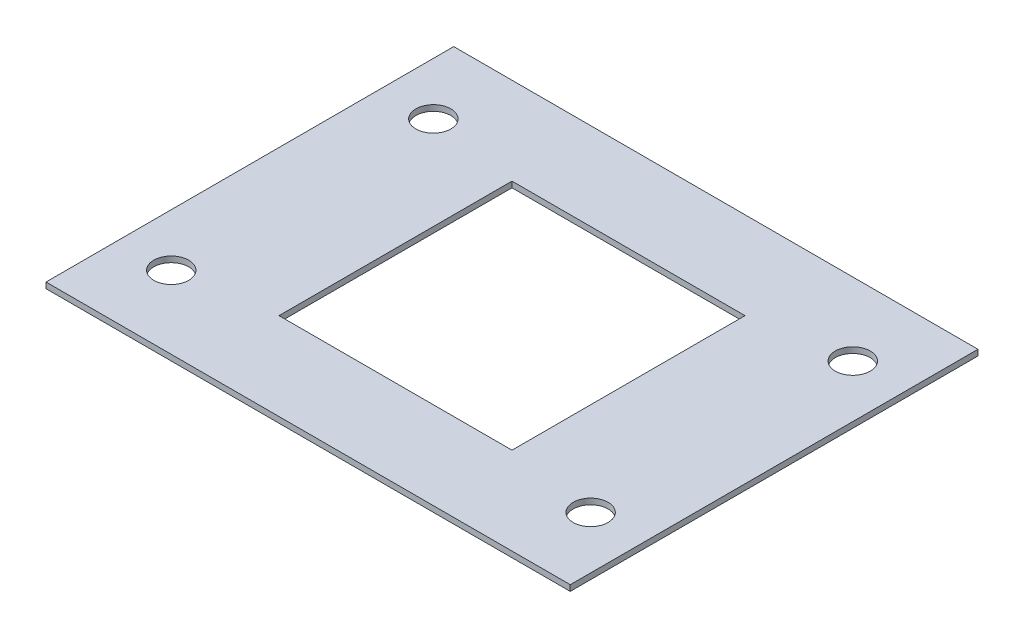
ISO-10303-21;
HEADER;
FILE_DESCRIPTION(('STEP AP214'),'2;1');
FILE_NAME('part.step','',(''),(''),'','','');
FILE_SCHEMA(('AUTOMOTIVE_DESIGN { 1 0 10303 214 1 1 1 1 }'));
ENDSEC;
DATA;
#1=APPLICATION_CONTEXT('core data for automotive mechanical design processes');
#2=APPLICATION_PROTOCOL_DEFINITION('international standard','automotive_design',2000,#1);
#3=PRODUCT_CONTEXT('',#1,'mechanical');
#4=PRODUCT('Part','Part','',(#3));
#5=PRODUCT_RELATED_PRODUCT_CATEGORY('part','',(#4));
#6=PRODUCT_DEFINITION_FORMATION('','',#4);
#7=PRODUCT_DEFINITION_CONTEXT('part definition',#1,'design');
#8=PRODUCT_DEFINITION('design','',#6,#7);
#9=PRODUCT_DEFINITION_SHAPE('','',#8);
#10=(LENGTH_UNIT() NAMED_UNIT(*) SI_UNIT(.MILLI.,.METRE.));
#11=(NAMED_UNIT(*) PLANE_ANGLE_UNIT() SI_UNIT($,.RADIAN.));
#12=(NAMED_UNIT(*) SI_UNIT($,.STERADIAN.) SOLID_ANGLE_UNIT());
#13=UNCERTAINTY_MEASURE_WITH_UNIT(LENGTH_MEASURE(1.E-05),#10,'distance_accuracy_value','');
#14=(GEOMETRIC_REPRESENTATION_CONTEXT(3) GLOBAL_UNCERTAINTY_ASSIGNED_CONTEXT((#13)) GLOBAL_UNIT_ASSIGNED_CONTEXT((#10,
#11,#12)) REPRESENTATION_CONTEXT('',''));
#15=CARTESIAN_POINT('',(0.,0.,0.));
#16=DIRECTION('',(0.,0.,1.));
#17=DIRECTION('',(1.,0.,0.));
#18=AXIS2_PLACEMENT_3D('',#15,#16,#17);
#19=CARTESIAN_POINT('',(-12.5,0.5,0.));
#20=DIRECTION('',(-1.,0.,0.));
#21=DIRECTION('',(0.,0.,1.));
#22=AXIS2_PLACEMENT_3D('',#19,#20,#21);
#23=PLANE('',#22);
#24=DIRECTION('',(0.,1.,0.));
#25=VECTOR('',#24,1.);
#26=CARTESIAN_POINT('',(-12.5,-9.5,-27.5));
#27=LINE('',#26,#25);
#28=CARTESIAN_POINT('',(-12.5,0.,-27.5));
#29=VERTEX_POINT('',#28);
#30=CARTESIAN_POINT('',(-12.5,0.5,-27.5));
#31=VERTEX_POINT('',#30);
#32=EDGE_CURVE('E97',#29,#31,#27,.T.);
#33=ORIENTED_EDGE('',*,*,#32,.F.);
#34=DIRECTION('',(0.,0.,-1.));
#35=VECTOR('',#34,1.);
#36=CARTESIAN_POINT('',(-12.5,0.,0.));
#37=LINE('',#36,#35);
#38=CARTESIAN_POINT('',(-12.5,0.,7.5));
#39=VERTEX_POINT('',#38);
#40=EDGE_CURVE('E149',#39,#29,#37,.T.);
#41=ORIENTED_EDGE('',*,*,#40,.F.);
#42=DIRECTION('',(0.,1.,0.));
#43=VECTOR('',#42,1.);
#44=CARTESIAN_POINT('',(-12.5,-9.5,7.5));
#45=LINE('',#44,#43);
#46=CARTESIAN_POINT('',(-12.5,0.5,7.5));
#47=VERTEX_POINT('',#46);
#48=EDGE_CURVE('E57',#39,#47,#45,.T.);
#49=ORIENTED_EDGE('',*,*,#48,.T.);
#50=DIRECTION('',(0.,0.,-1.));
#51=VECTOR('',#50,1.);
#52=CARTESIAN_POINT('',(-12.5,0.5,0.));
#53=LINE('',#52,#51);
#54=EDGE_CURVE('E112',#47,#31,#53,.T.);
#55=ORIENTED_EDGE('',*,*,#54,.T.);
#56=EDGE_LOOP('',(#33,#41,#49,#55));
#57=FACE_BOUND('',#56,.T.);
#58=ADVANCED_FACE('F35',(#57),#23,.T.);
#59=CARTESIAN_POINT('',(32.5,0.5,0.));
#60=DIRECTION('',(-1.,0.,0.));
#61=DIRECTION('',(0.,0.,1.));
#62=AXIS2_PLACEMENT_3D('',#59,#60,#61);
#63=PLANE('',#62);
#64=DIRECTION('',(0.,0.,-1.));
#65=VECTOR('',#64,1.);
#66=CARTESIAN_POINT('',(32.5,0.,0.));
#67=LINE('',#66,#65);
#68=CARTESIAN_POINT('',(32.5,0.,7.5));
#69=VERTEX_POINT('',#68);
#70=CARTESIAN_POINT('',(32.5,0.,-27.5));
#71=VERTEX_POINT('',#70);
#72=EDGE_CURVE('E151',#69,#71,#67,.T.);
#73=ORIENTED_EDGE('',*,*,#72,.T.);
#74=DIRECTION('',(0.,1.,0.));
#75=VECTOR('',#74,1.);
#76=CARTESIAN_POINT('',(32.5,-9.5,-27.5));
#77=LINE('',#76,#75);
#78=CARTESIAN_POINT('',(32.5,0.5,-27.5));
#79=VERTEX_POINT('',#78);
#80=EDGE_CURVE('E50',#71,#79,#77,.T.);
#81=ORIENTED_EDGE('',*,*,#80,.T.);
#82=DIRECTION('',(0.,0.,-1.));
#83=VECTOR('',#82,1.);
#84=CARTESIAN_POINT('',(32.5,0.5,0.));
#85=LINE('',#84,#83);
#86=CARTESIAN_POINT('',(32.5,0.5,7.5));
#87=VERTEX_POINT('',#86);
#88=EDGE_CURVE('E114',#87,#79,#85,.T.);
#89=ORIENTED_EDGE('',*,*,#88,.F.);
#90=DIRECTION('',(0.,1.,0.));
#91=VECTOR('',#90,1.);
#92=CARTESIAN_POINT('',(32.5,-9.5,7.5));
#93=LINE('',#92,#91);
#94=EDGE_CURVE('E167',#69,#87,#93,.T.);
#95=ORIENTED_EDGE('',*,*,#94,.F.);
#96=EDGE_LOOP('',(#73,#81,#89,#95));
#97=FACE_BOUND('',#96,.T.);
#98=ADVANCED_FACE('F169',(#97),#63,.F.);
#99=CARTESIAN_POINT('',(20.,0.5,0.));
#100=DIRECTION('',(-1.,0.,0.));
#101=DIRECTION('',(0.,0.,1.));
#102=AXIS2_PLACEMENT_3D('',#99,#100,#101);
#103=PLANE('',#102);
#104=DIRECTION('',(0.,0.,-1.));
#105=VECTOR('',#104,1.);
#106=CARTESIAN_POINT('',(20.,0.,0.));
#107=LINE('',#106,#105);
#108=CARTESIAN_POINT('',(20.,0.,0.));
#109=VERTEX_POINT('',#108);
#110=CARTESIAN_POINT('',(20.,0.,-20.));
#111=VERTEX_POINT('',#110);
#112=EDGE_CURVE('E134',#109,#111,#107,.T.);
#113=ORIENTED_EDGE('',*,*,#112,.F.);
#114=DIRECTION('',(0.,-1.,0.));
#115=VECTOR('',#114,1.);
#116=CARTESIAN_POINT('',(20.,0.5,0.));
#117=LINE('',#116,#115);
#118=CARTESIAN_POINT('',(20.,0.5,0.));
#119=VERTEX_POINT('',#118);
#120=EDGE_CURVE('E161',#119,#109,#117,.T.);
#121=ORIENTED_EDGE('',*,*,#120,.F.);
#122=DIRECTION('',(0.,0.,-1.));
#123=VECTOR('',#122,1.);
#124=CARTESIAN_POINT('',(20.,0.5,0.));
#125=LINE('',#124,#123);
#126=CARTESIAN_POINT('',(20.,0.5,-20.));
#127=VERTEX_POINT('',#126);
#128=EDGE_CURVE('E183',#119,#127,#125,.T.);
#129=ORIENTED_EDGE('',*,*,#128,.T.);
#130=DIRECTION('',(0.,-1.,0.));
#131=VECTOR('',#130,1.);
#132=CARTESIAN_POINT('',(20.,0.5,-20.));
#133=LINE('',#132,#131);
#134=EDGE_CURVE('E118',#127,#111,#133,.T.);
#135=ORIENTED_EDGE('',*,*,#134,.T.);
#136=EDGE_LOOP('',(#113,#121,#129,#135));
#137=FACE_BOUND('',#136,.T.);
#138=ADVANCED_FACE('F202',(#137),#103,.T.);
#139=CARTESIAN_POINT('',(0.,0.5,0.));
#140=DIRECTION('',(0.,0.,-1.));
#141=DIRECTION('',(-1.,0.,0.));
#142=AXIS2_PLACEMENT_3D('',#139,#140,#141);
#143=PLANE('',#142);
#144=DIRECTION('',(1.,0.,0.));
#145=VECTOR('',#144,1.);
#146=CARTESIAN_POINT('',(0.,0.,0.));
#147=LINE('',#146,#145);
#148=CARTESIAN_POINT('',(0.,0.,0.));
#149=VERTEX_POINT('',#148);
#150=EDGE_CURVE('E137',#149,#109,#147,.T.);
#151=ORIENTED_EDGE('',*,*,#150,.F.);
#152=DIRECTION('',(0.,-1.,0.));
#153=VECTOR('',#152,1.);
#154=CARTESIAN_POINT('',(0.,0.5,0.));
#155=LINE('',#154,#153);
#156=CARTESIAN_POINT('',(0.,0.5,0.));
#157=VERTEX_POINT('',#156);
#158=EDGE_CURVE('E159',#157,#149,#155,.T.);
#159=ORIENTED_EDGE('',*,*,#158,.F.);
#160=DIRECTION('',(1.,0.,0.));
#161=VECTOR('',#160,1.);
#162=CARTESIAN_POINT('',(0.,0.5,0.));
#163=LINE('',#162,#161);
#164=EDGE_CURVE('E186',#157,#119,#163,.T.);
#165=ORIENTED_EDGE('',*,*,#164,.T.);
#166=ORIENTED_EDGE('',*,*,#120,.T.);
#167=EDGE_LOOP('',(#151,#159,#165,#166));
#168=FACE_BOUND('',#167,.T.);
#169=ADVANCED_FACE('F205',(#168),#143,.T.);
#170=CARTESIAN_POINT('',(0.,0.5,0.));
#171=DIRECTION('',(-1.,0.,0.));
#172=DIRECTION('',(0.,0.,1.));
#173=AXIS2_PLACEMENT_3D('',#170,#171,#172);
#174=PLANE('',#173);
#175=DIRECTION('',(0.,0.,-1.));
#176=VECTOR('',#175,1.);
#177=CARTESIAN_POINT('',(0.,0.,0.));
#178=LINE('',#177,#176);
#179=CARTESIAN_POINT('',(0.,0.,-20.));
#180=VERTEX_POINT('',#179);
#181=EDGE_CURVE('E140',#149,#180,#178,.T.);
#182=ORIENTED_EDGE('',*,*,#181,.T.);
#183=DIRECTION('',(0.,-1.,0.));
#184=VECTOR('',#183,1.);
#185=CARTESIAN_POINT('',(0.,0.5,-20.));
#186=LINE('',#185,#184);
#187=CARTESIAN_POINT('',(0.,0.5,-20.));
#188=VERTEX_POINT('',#187);
#189=EDGE_CURVE('E156',#188,#180,#186,.T.);
#190=ORIENTED_EDGE('',*,*,#189,.F.);
#191=DIRECTION('',(0.,0.,-1.));
#192=VECTOR('',#191,1.);
#193=CARTESIAN_POINT('',(0.,0.5,0.));
#194=LINE('',#193,#192);
#195=EDGE_CURVE('E189',#157,#188,#194,.T.);
#196=ORIENTED_EDGE('',*,*,#195,.F.);
#197=ORIENTED_EDGE('',*,*,#158,.T.);
#198=EDGE_LOOP('',(#182,#190,#196,#197));
#199=FACE_BOUND('',#198,.T.);
#200=ADVANCED_FACE('F208',(#199),#174,.F.);
#201=CARTESIAN_POINT('',(-8.,0.5,1.25));
#202=DIRECTION('',(0.,-1.,0.));
#203=DIRECTION('',(0.,0.,-1.));
#204=AXIS2_PLACEMENT_3D('',#201,#202,#203);
#205=CYLINDRICAL_SURFACE('',#204,1.5);
#206=CARTESIAN_POINT('',(-8.,0.5,1.25));
#207=DIRECTION('',(0.,1.,0.));
#208=DIRECTION('',(0.,0.,1.));
#209=AXIS2_PLACEMENT_3D('',#206,#207,#208);
#210=CIRCLE('',#209,1.5);
#211=CARTESIAN_POINT('',(-8.,0.5,2.75));
#212=VERTEX_POINT('',#211);
#213=EDGE_CURVE('E116',#212,#212,#210,.F.);
#214=ORIENTED_EDGE('',*,*,#213,.F.);
#215=EDGE_LOOP('',(#214));
#216=FACE_BOUND('',#215,.T.);
#217=CARTESIAN_POINT('',(-8.,0.,1.25));
#218=DIRECTION('',(0.,1.,0.));
#219=DIRECTION('',(0.,0.,1.));
#220=AXIS2_PLACEMENT_3D('',#217,#218,#219);
#221=CIRCLE('',#220,1.5);
#222=CARTESIAN_POINT('',(-8.,0.,2.75));
#223=VERTEX_POINT('',#222);
#224=EDGE_CURVE('E146',#223,#223,#221,.F.);
#225=ORIENTED_EDGE('',*,*,#224,.T.);
#226=EDGE_LOOP('',(#225));
#227=FACE_BOUND('',#226,.T.);
#228=ADVANCED_FACE('F216',(#216,#227),#205,.F.);
#229=CARTESIAN_POINT('',(0.,0.5,-20.));
#230=DIRECTION('',(0.,0.,-1.));
#231=DIRECTION('',(-1.,0.,0.));
#232=AXIS2_PLACEMENT_3D('',#229,#230,#231);
#233=PLANE('',#232);
#234=DIRECTION('',(1.,0.,0.));
#235=VECTOR('',#234,1.);
#236=CARTESIAN_POINT('',(0.,0.,-20.));
#237=LINE('',#236,#235);
#238=EDGE_CURVE('E143',#180,#111,#237,.T.);
#239=ORIENTED_EDGE('',*,*,#238,.T.);
#240=ORIENTED_EDGE('',*,*,#134,.F.);
#241=DIRECTION('',(1.,0.,0.));
#242=VECTOR('',#241,1.);
#243=CARTESIAN_POINT('',(0.,0.5,-20.));
#244=LINE('',#243,#242);
#245=EDGE_CURVE('E121',#188,#127,#244,.T.);
#246=ORIENTED_EDGE('',*,*,#245,.F.);
#247=ORIENTED_EDGE('',*,*,#189,.T.);
#248=EDGE_LOOP('',(#239,#240,#246,#247));
#249=FACE_BOUND('',#248,.T.);
#250=ADVANCED_FACE('F199',(#249),#233,.F.);
#251=CARTESIAN_POINT('',(-8.,0.5,-21.25));
#252=DIRECTION('',(0.,-1.,0.));
#253=DIRECTION('',(0.,0.,-1.));
#254=AXIS2_PLACEMENT_3D('',#251,#252,#253);
#255=CYLINDRICAL_SURFACE('',#254,1.5);
#256=CARTESIAN_POINT('',(-8.,0.5,-21.25));
#257=DIRECTION('',(0.,1.,0.));
#258=DIRECTION('',(0.,0.,1.));
#259=AXIS2_PLACEMENT_3D('',#256,#257,#258);
#260=CIRCLE('',#259,1.5);
#261=CARTESIAN_POINT('',(-8.,0.5,-19.75));
#262=VERTEX_POINT('',#261);
#263=EDGE_CURVE('E180',#262,#262,#260,.F.);
#264=ORIENTED_EDGE('',*,*,#263,.F.);
#265=EDGE_LOOP('',(#264));
#266=FACE_BOUND('',#265,.T.);
#267=CARTESIAN_POINT('',(-8.,0.,-21.25));
#268=DIRECTION('',(0.,1.,0.));
#269=DIRECTION('',(0.,0.,1.));
#270=AXIS2_PLACEMENT_3D('',#267,#268,#269);
#271=CIRCLE('',#270,1.5);
#272=CARTESIAN_POINT('',(-8.,0.,-19.75));
#273=VERTEX_POINT('',#272);
#274=EDGE_CURVE('E131',#273,#273,#271,.F.);
#275=ORIENTED_EDGE('',*,*,#274,.T.);
#276=EDGE_LOOP('',(#275));
#277=FACE_BOUND('',#276,.T.);
#278=ADVANCED_FACE('F224',(#266,#277),#255,.F.);
#279=CARTESIAN_POINT('',(28.,0.5,-21.25));
#280=DIRECTION('',(0.,-1.,0.));
#281=DIRECTION('',(0.,0.,-1.));
#282=AXIS2_PLACEMENT_3D('',#279,#280,#281);
#283=CYLINDRICAL_SURFACE('',#282,1.5);
#284=CARTESIAN_POINT('',(28.,0.5,-21.25));
#285=DIRECTION('',(0.,1.,0.));
#286=DIRECTION('',(0.,0.,1.));
#287=AXIS2_PLACEMENT_3D('',#284,#285,#286);
#288=CIRCLE('',#287,1.5);
#289=CARTESIAN_POINT('',(28.,0.5,-19.75));
#290=VERTEX_POINT('',#289);
#291=EDGE_CURVE('E177',#290,#290,#288,.T.);
#292=ORIENTED_EDGE('',*,*,#291,.T.);
#293=EDGE_LOOP('',(#292));
#294=FACE_BOUND('',#293,.T.);
#295=CARTESIAN_POINT('',(28.,0.,-21.25));
#296=DIRECTION('',(0.,1.,0.));
#297=DIRECTION('',(0.,0.,1.));
#298=AXIS2_PLACEMENT_3D('',#295,#296,#297);
#299=CIRCLE('',#298,1.5);
#300=CARTESIAN_POINT('',(28.,0.,-19.75));
#301=VERTEX_POINT('',#300);
#302=EDGE_CURVE('E128',#301,#301,#299,.T.);
#303=ORIENTED_EDGE('',*,*,#302,.F.);
#304=EDGE_LOOP('',(#303));
#305=FACE_BOUND('',#304,.T.);
#306=ADVANCED_FACE('F266',(#294,#305),#283,.F.);
#307=CARTESIAN_POINT('',(28.,0.5,1.25));
#308=DIRECTION('',(0.,-1.,0.));
#309=DIRECTION('',(0.,0.,-1.));
#310=AXIS2_PLACEMENT_3D('',#307,#308,#309);
#311=CYLINDRICAL_SURFACE('',#310,1.5);
#312=CARTESIAN_POINT('',(28.,0.5,1.25));
#313=DIRECTION('',(0.,1.,0.));
#314=DIRECTION('',(0.,0.,1.));
#315=AXIS2_PLACEMENT_3D('',#312,#313,#314);
#316=CIRCLE('',#315,1.5);
#317=CARTESIAN_POINT('',(28.,0.5,2.75));
#318=VERTEX_POINT('',#317);
#319=EDGE_CURVE('E154',#318,#318,#316,.T.);
#320=ORIENTED_EDGE('',*,*,#319,.T.);
#321=EDGE_LOOP('',(#320));
#322=FACE_BOUND('',#321,.T.);
#323=CARTESIAN_POINT('',(28.,0.,1.25));
#324=DIRECTION('',(0.,1.,0.));
#325=DIRECTION('',(0.,0.,1.));
#326=AXIS2_PLACEMENT_3D('',#323,#324,#325);
#327=CIRCLE('',#326,1.5);
#328=CARTESIAN_POINT('',(28.,0.,2.75));
#329=VERTEX_POINT('',#328);
#330=EDGE_CURVE('E125',#329,#329,#327,.T.);
#331=ORIENTED_EDGE('',*,*,#330,.F.);
#332=EDGE_LOOP('',(#331));
#333=FACE_BOUND('',#332,.T.);
#334=ADVANCED_FACE('F37',(#322,#333),#311,.F.);
#335=CARTESIAN_POINT('',(0.,0.5,0.));
#336=DIRECTION('',(0.,1.,0.));
#337=DIRECTION('',(0.,0.,1.));
#338=AXIS2_PLACEMENT_3D('',#335,#336,#337);
#339=PLANE('',#338);
#340=DIRECTION('',(1.,0.,0.));
#341=VECTOR('',#340,1.);
#342=CARTESIAN_POINT('',(-12.5,0.5,-27.5));
#343=LINE('',#342,#341);
#344=EDGE_CURVE('E100',#31,#79,#343,.T.);
#345=ORIENTED_EDGE('',*,*,#344,.F.);
#346=ORIENTED_EDGE('',*,*,#54,.F.);
#347=DIRECTION('',(-1.,0.,0.));
#348=VECTOR('',#347,1.);
#349=CARTESIAN_POINT('',(32.5,0.5,7.5));
#350=LINE('',#349,#348);
#351=EDGE_CURVE('E170',#87,#47,#350,.T.);
#352=ORIENTED_EDGE('',*,*,#351,.F.);
#353=ORIENTED_EDGE('',*,*,#88,.T.);
#354=EDGE_LOOP('',(#345,#346,#352,#353));
#355=FACE_BOUND('',#354,.T.);
#356=ORIENTED_EDGE('',*,*,#319,.F.);
#357=EDGE_LOOP('',(#356));
#358=FACE_BOUND('',#357,.T.);
#359=ORIENTED_EDGE('',*,*,#291,.F.);
#360=EDGE_LOOP('',(#359));
#361=FACE_BOUND('',#360,.T.);
#362=ORIENTED_EDGE('',*,*,#263,.T.);
#363=EDGE_LOOP('',(#362));
#364=FACE_BOUND('',#363,.T.);
#365=ORIENTED_EDGE('',*,*,#128,.F.);
#366=ORIENTED_EDGE('',*,*,#164,.F.);
#367=ORIENTED_EDGE('',*,*,#195,.T.);
#368=ORIENTED_EDGE('',*,*,#245,.T.);
#369=EDGE_LOOP('',(#365,#366,#367,#368));
#370=FACE_BOUND('',#369,.T.);
#371=ORIENTED_EDGE('',*,*,#213,.T.);
#372=EDGE_LOOP('',(#371));
#373=FACE_BOUND('',#372,.T.);
#374=ADVANCED_FACE('F109',(#355,#358,#361,#364,#370,#373),#339,.T.);
#375=CARTESIAN_POINT('',(0.,0.,0.));
#376=DIRECTION('',(0.,1.,0.));
#377=DIRECTION('',(0.,0.,1.));
#378=AXIS2_PLACEMENT_3D('',#375,#376,#377);
#379=PLANE('',#378);
#380=ORIENTED_EDGE('',*,*,#330,.T.);
#381=EDGE_LOOP('',(#380));
#382=FACE_BOUND('',#381,.T.);
#383=ORIENTED_EDGE('',*,*,#302,.T.);
#384=EDGE_LOOP('',(#383));
#385=FACE_BOUND('',#384,.T.);
#386=ORIENTED_EDGE('',*,*,#274,.F.);
#387=EDGE_LOOP('',(#386));
#388=FACE_BOUND('',#387,.T.);
#389=ORIENTED_EDGE('',*,*,#112,.T.);
#390=ORIENTED_EDGE('',*,*,#238,.F.);
#391=ORIENTED_EDGE('',*,*,#181,.F.);
#392=ORIENTED_EDGE('',*,*,#150,.T.);
#393=EDGE_LOOP('',(#389,#390,#391,#392));
#394=FACE_BOUND('',#393,.T.);
#395=ORIENTED_EDGE('',*,*,#224,.F.);
#396=EDGE_LOOP('',(#395));
#397=FACE_BOUND('',#396,.T.);
#398=ORIENTED_EDGE('',*,*,#40,.T.);
#399=DIRECTION('',(1.,0.,0.));
#400=VECTOR('',#399,1.);
#401=CARTESIAN_POINT('',(0.,0.,-27.5));
#402=LINE('',#401,#400);
#403=EDGE_CURVE('E11',#29,#71,#402,.T.);
#404=ORIENTED_EDGE('',*,*,#403,.T.);
#405=ORIENTED_EDGE('',*,*,#72,.F.);
#406=DIRECTION('',(-1.,0.,0.));
#407=VECTOR('',#406,1.);
#408=CARTESIAN_POINT('',(0.,0.,7.5));
#409=LINE('',#408,#407);
#410=EDGE_CURVE('E43',#69,#39,#409,.T.);
#411=ORIENTED_EDGE('',*,*,#410,.T.);
#412=EDGE_LOOP('',(#398,#404,#405,#411));
#413=FACE_BOUND('',#412,.T.);
#414=ADVANCED_FACE('F164',(#382,#385,#388,#394,#397,#413),#379,.F.);
#415=CARTESIAN_POINT('',(32.5,-9.5,7.5));
#416=DIRECTION('',(0.,0.,-1.));
#417=DIRECTION('',(-1.,0.,0.));
#418=AXIS2_PLACEMENT_3D('',#415,#416,#417);
#419=PLANE('',#418);
#420=ORIENTED_EDGE('',*,*,#94,.T.);
#421=ORIENTED_EDGE('',*,*,#351,.T.);
#422=ORIENTED_EDGE('',*,*,#48,.F.);
#423=ORIENTED_EDGE('',*,*,#410,.F.);
#424=EDGE_LOOP('',(#420,#421,#422,#423));
#425=FACE_BOUND('',#424,.T.);
#426=ADVANCED_FACE('F166',(#425),#419,.F.);
#427=CARTESIAN_POINT('',(-12.5,-9.5,-27.5));
#428=DIRECTION('',(0.,0.,1.));
#429=DIRECTION('',(1.,0.,0.));
#430=AXIS2_PLACEMENT_3D('',#427,#428,#429);
#431=PLANE('',#430);
#432=ORIENTED_EDGE('',*,*,#32,.T.);
#433=ORIENTED_EDGE('',*,*,#344,.T.);
#434=ORIENTED_EDGE('',*,*,#80,.F.);
#435=ORIENTED_EDGE('',*,*,#403,.F.);
#436=EDGE_LOOP('',(#432,#433,#434,#435));
#437=FACE_BOUND('',#436,.T.);
#438=ADVANCED_FACE('F99',(#437),#431,.F.);
#439=CLOSED_SHELL('',(#58,#98,#138,#169,#200,#228,#250,#278,#306,#334,#374,#414,#426,#438));
#440=MANIFOLD_SOLID_BREP('B2',#439);
#441=ADVANCED_BREP_SHAPE_REPRESENTATION('',(#18,#440),#14);
#442=SHAPE_DEFINITION_REPRESENTATION(#9,#441);
ENDSEC;
END-ISO-10303-21;
